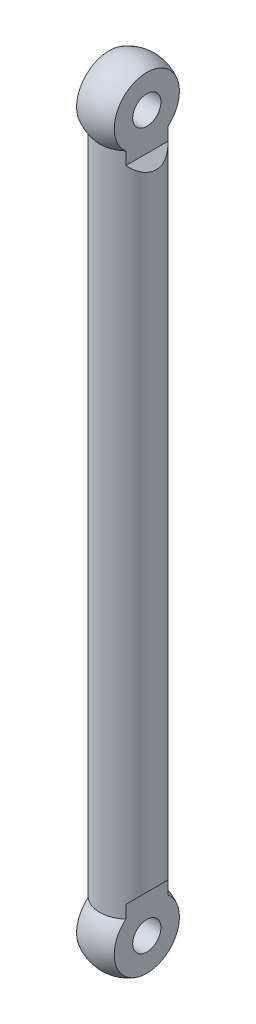
ISO-10303-21;
HEADER;
FILE_DESCRIPTION(('STEP AP214'),'2;1');
FILE_NAME('part.step','',(''),(''),'','','');
FILE_SCHEMA(('AUTOMOTIVE_DESIGN { 1 0 10303 214 1 1 1 1 }'));
ENDSEC;
DATA;
#1=APPLICATION_CONTEXT('core data for automotive mechanical design processes');
#2=APPLICATION_PROTOCOL_DEFINITION('international standard','automotive_design',2000,#1);
#3=PRODUCT_CONTEXT('',#1,'mechanical');
#4=PRODUCT('Part','Part','',(#3));
#5=PRODUCT_RELATED_PRODUCT_CATEGORY('part','',(#4));
#6=PRODUCT_DEFINITION_FORMATION('','',#4);
#7=PRODUCT_DEFINITION_CONTEXT('part definition',#1,'design');
#8=PRODUCT_DEFINITION('design','',#6,#7);
#9=PRODUCT_DEFINITION_SHAPE('','',#8);
#10=(LENGTH_UNIT() NAMED_UNIT(*) SI_UNIT(.MILLI.,.METRE.));
#11=(NAMED_UNIT(*) PLANE_ANGLE_UNIT() SI_UNIT($,.RADIAN.));
#12=(NAMED_UNIT(*) SI_UNIT($,.STERADIAN.) SOLID_ANGLE_UNIT());
#13=UNCERTAINTY_MEASURE_WITH_UNIT(LENGTH_MEASURE(1.E-05),#10,'distance_accuracy_value','');
#14=(GEOMETRIC_REPRESENTATION_CONTEXT(3) GLOBAL_UNCERTAINTY_ASSIGNED_CONTEXT((#13)) GLOBAL_UNIT_ASSIGNED_CONTEXT((#10,
#11,#12)) REPRESENTATION_CONTEXT('',''));
#15=CARTESIAN_POINT('',(0.,0.,0.));
#16=DIRECTION('',(0.,0.,1.));
#17=DIRECTION('',(1.,0.,0.));
#18=AXIS2_PLACEMENT_3D('',#15,#16,#17);
#19=CARTESIAN_POINT('',(0.,76.,0.));
#20=DIRECTION('',(0.,-1.,0.));
#21=DIRECTION('',(0.,0.,-1.));
#22=AXIS2_PLACEMENT_3D('',#19,#20,#21);
#23=SPHERICAL_SURFACE('',#22,4.);
#24=CARTESIAN_POINT('',(0.,73.3542486889354,0.));
#25=DIRECTION('',(0.,-1.,0.));
#26=DIRECTION('',(0.,0.,-1.));
#27=AXIS2_PLACEMENT_3D('',#24,#25,#26);
#28=CIRCLE('',#27,3.);
#29=CARTESIAN_POINT('',(-2.,73.3542486889354,-2.23606797749979));
#30=VERTEX_POINT('',#29);
#31=CARTESIAN_POINT('',(2.,73.3542486889354,-2.23606797749979));
#32=VERTEX_POINT('',#31);
#33=EDGE_CURVE('E185',#30,#32,#28,.T.);
#34=ORIENTED_EDGE('',*,*,#33,.F.);
#35=CARTESIAN_POINT('',(-2.,76.,0.));
#36=DIRECTION('',(-1.,0.,0.));
#37=DIRECTION('',(0.,-1.,0.));
#38=AXIS2_PLACEMENT_3D('',#35,#36,#37);
#39=CIRCLE('',#38,3.46410161513776);
#40=CARTESIAN_POINT('',(-2.00000000000001,73.3542486889354,2.23606797749978));
#41=VERTEX_POINT('',#40);
#42=EDGE_CURVE('E163',#30,#41,#39,.F.);
#43=ORIENTED_EDGE('',*,*,#42,.T.);
#44=CARTESIAN_POINT('',(2.00000000000001,73.3542486889354,2.23606797749978));
#45=VERTEX_POINT('',#44);
#46=EDGE_CURVE('E181',#45,#41,#28,.T.);
#47=ORIENTED_EDGE('',*,*,#46,.F.);
#48=CARTESIAN_POINT('',(2.,76.,0.));
#49=DIRECTION('',(-1.,0.,0.));
#50=DIRECTION('',(0.,-1.,0.));
#51=AXIS2_PLACEMENT_3D('',#48,#49,#50);
#52=CIRCLE('',#51,3.46410161513776);
#53=EDGE_CURVE('E67',#32,#45,#52,.F.);
#54=ORIENTED_EDGE('',*,*,#53,.F.);
#55=EDGE_LOOP('',(#34,#43,#47,#54));
#56=FACE_BOUND('',#55,.T.);
#57=ADVANCED_FACE('F44',(#56),#23,.T.);
#58=CARTESIAN_POINT('',(0.,0.,0.));
#59=DIRECTION('',(0.,-1.,0.));
#60=DIRECTION('',(0.,0.,1.));
#61=AXIS2_PLACEMENT_3D('',#58,#59,#60);
#62=SPHERICAL_SURFACE('',#61,4.);
#63=CARTESIAN_POINT('',(0.,2.64575131106459,0.));
#64=DIRECTION('',(0.,-1.,0.));
#65=DIRECTION('',(0.,0.,-1.));
#66=AXIS2_PLACEMENT_3D('',#63,#64,#65);
#67=CIRCLE('',#66,3.);
#68=CARTESIAN_POINT('',(2.,2.64575131106459,2.23606797749979));
#69=VERTEX_POINT('',#68);
#70=CARTESIAN_POINT('',(-2.,2.64575131106459,2.23606797749979));
#71=VERTEX_POINT('',#70);
#72=EDGE_CURVE('E190',#69,#71,#67,.T.);
#73=ORIENTED_EDGE('',*,*,#72,.T.);
#74=CARTESIAN_POINT('',(-2.,0.,0.));
#75=DIRECTION('',(-1.,0.,0.));
#76=DIRECTION('',(0.,-1.,0.));
#77=AXIS2_PLACEMENT_3D('',#74,#75,#76);
#78=CIRCLE('',#77,3.46410161513775);
#79=CARTESIAN_POINT('',(-2.,2.64575131106459,-2.23606797749979));
#80=VERTEX_POINT('',#79);
#81=EDGE_CURVE('E65',#71,#80,#78,.F.);
#82=ORIENTED_EDGE('',*,*,#81,.T.);
#83=CARTESIAN_POINT('',(2.,2.64575131106459,-2.23606797749979));
#84=VERTEX_POINT('',#83);
#85=EDGE_CURVE('E135',#80,#84,#67,.T.);
#86=ORIENTED_EDGE('',*,*,#85,.T.);
#87=CARTESIAN_POINT('',(2.,0.,0.));
#88=DIRECTION('',(-1.,0.,0.));
#89=DIRECTION('',(0.,-1.,0.));
#90=AXIS2_PLACEMENT_3D('',#87,#88,#89);
#91=CIRCLE('',#90,3.46410161513775);
#92=EDGE_CURVE('E171',#69,#84,#91,.F.);
#93=ORIENTED_EDGE('',*,*,#92,.F.);
#94=EDGE_LOOP('',(#73,#82,#86,#93));
#95=FACE_BOUND('',#94,.T.);
#96=ADVANCED_FACE('F212',(#95),#62,.T.);
#97=CARTESIAN_POINT('',(0.,-21.6284069477248,0.));
#98=DIRECTION('',(0.,-1.,0.));
#99=DIRECTION('',(0.,0.,-1.));
#100=AXIS2_PLACEMENT_3D('',#97,#98,#99);
#101=CYLINDRICAL_SURFACE('',#100,3.);
#102=ORIENTED_EDGE('',*,*,#85,.F.);
#103=DIRECTION('',(0.,-1.,0.));
#104=VECTOR('',#103,1.);
#105=CARTESIAN_POINT('',(-2.,-21.6284069477248,-2.23606797749979));
#106=LINE('',#105,#104);
#107=CARTESIAN_POINT('',(-2.,3.99999999999999,-2.23606797749979));
#108=VERTEX_POINT('',#107);
#109=EDGE_CURVE('E117',#80,#108,#106,.F.);
#110=ORIENTED_EDGE('',*,*,#109,.T.);
#111=CARTESIAN_POINT('',(0.,2.00000000000001,0.));
#112=DIRECTION('',(-0.707106781186544,-0.707106781186552,0.));
#113=DIRECTION('',(0.707106781186552,-0.707106781186544,0.));
#114=AXIS2_PLACEMENT_3D('',#111,#112,#113);
#115=ELLIPSE('',#114,4.24264068711926,3.);
#116=CARTESIAN_POINT('',(-2.,3.99999999999999,2.23606797749979));
#117=VERTEX_POINT('',#116);
#118=EDGE_CURVE('E114',#108,#117,#115,.F.);
#119=ORIENTED_EDGE('',*,*,#118,.T.);
#120=DIRECTION('',(0.,-1.,0.));
#121=VECTOR('',#120,1.);
#122=CARTESIAN_POINT('',(-2.,-21.6284069477248,2.23606797749979));
#123=LINE('',#122,#121);
#124=EDGE_CURVE('E123',#117,#71,#123,.T.);
#125=ORIENTED_EDGE('',*,*,#124,.T.);
#126=ORIENTED_EDGE('',*,*,#72,.F.);
#127=DIRECTION('',(0.,-1.,0.));
#128=VECTOR('',#127,1.);
#129=CARTESIAN_POINT('',(2.,-21.6284069477248,2.23606797749979));
#130=LINE('',#129,#128);
#131=CARTESIAN_POINT('',(2.,3.99999999999999,2.23606797749979));
#132=VERTEX_POINT('',#131);
#133=EDGE_CURVE('E194',#132,#69,#130,.T.);
#134=ORIENTED_EDGE('',*,*,#133,.F.);
#135=CARTESIAN_POINT('',(0.,2.00000000000001,0.));
#136=DIRECTION('',(-0.707106781186544,0.707106781186552,0.));
#137=DIRECTION('',(-0.707106781186552,-0.707106781186544,0.));
#138=AXIS2_PLACEMENT_3D('',#135,#136,#137);
#139=ELLIPSE('',#138,4.24264068711926,3.);
#140=CARTESIAN_POINT('',(2.,3.99999999999999,-2.23606797749979));
#141=VERTEX_POINT('',#140);
#142=EDGE_CURVE('E193',#141,#132,#139,.F.);
#143=ORIENTED_EDGE('',*,*,#142,.F.);
#144=DIRECTION('',(0.,-1.,0.));
#145=VECTOR('',#144,1.);
#146=CARTESIAN_POINT('',(2.,-21.6284069477248,-2.23606797749979));
#147=LINE('',#146,#145);
#148=EDGE_CURVE('E197',#84,#141,#147,.F.);
#149=ORIENTED_EDGE('',*,*,#148,.F.);
#150=EDGE_LOOP('',(#102,#110,#119,#125,#126,#134,#143,#149));
#151=FACE_BOUND('',#150,.T.);
#152=CARTESIAN_POINT('',(0.,74.,0.));
#153=DIRECTION('',(-0.707106781186544,0.707106781186552,0.));
#154=DIRECTION('',(-0.707106781186552,-0.707106781186544,0.));
#155=AXIS2_PLACEMENT_3D('',#152,#153,#154);
#156=ELLIPSE('',#155,4.24264068711926,3.);
#157=CARTESIAN_POINT('',(-2.,72.,2.23606797749978));
#158=VERTEX_POINT('',#157);
#159=CARTESIAN_POINT('',(-2.,72.,-2.23606797749978));
#160=VERTEX_POINT('',#159);
#161=EDGE_CURVE('E134',#158,#160,#156,.F.);
#162=ORIENTED_EDGE('',*,*,#161,.T.);
#163=DIRECTION('',(0.,-1.,0.));
#164=VECTOR('',#163,1.);
#165=CARTESIAN_POINT('',(-2.00000000000001,-21.6284069477248,-2.23606797749978));
#166=LINE('',#165,#164);
#167=EDGE_CURVE('E11',#160,#30,#166,.F.);
#168=ORIENTED_EDGE('',*,*,#167,.T.);
#169=ORIENTED_EDGE('',*,*,#33,.T.);
#170=DIRECTION('',(0.,-1.,0.));
#171=VECTOR('',#170,1.);
#172=CARTESIAN_POINT('',(2.00000000000001,-21.6284069477248,-2.23606797749978));
#173=LINE('',#172,#171);
#174=CARTESIAN_POINT('',(2.,72.,-2.23606797749978));
#175=VERTEX_POINT('',#174);
#176=EDGE_CURVE('E210',#175,#32,#173,.F.);
#177=ORIENTED_EDGE('',*,*,#176,.F.);
#178=CARTESIAN_POINT('',(0.,74.,0.));
#179=DIRECTION('',(-0.707106781186544,-0.707106781186552,0.));
#180=DIRECTION('',(0.707106781186552,-0.707106781186544,0.));
#181=AXIS2_PLACEMENT_3D('',#178,#179,#180);
#182=ELLIPSE('',#181,4.24264068711926,3.);
#183=CARTESIAN_POINT('',(2.,72.,2.23606797749978));
#184=VERTEX_POINT('',#183);
#185=EDGE_CURVE('E204',#184,#175,#182,.F.);
#186=ORIENTED_EDGE('',*,*,#185,.F.);
#187=DIRECTION('',(0.,-1.,0.));
#188=VECTOR('',#187,1.);
#189=CARTESIAN_POINT('',(2.00000000000001,-21.6284069477248,2.23606797749978));
#190=LINE('',#189,#188);
#191=EDGE_CURVE('E203',#45,#184,#190,.T.);
#192=ORIENTED_EDGE('',*,*,#191,.F.);
#193=ORIENTED_EDGE('',*,*,#46,.T.);
#194=DIRECTION('',(0.,-1.,0.));
#195=VECTOR('',#194,1.);
#196=CARTESIAN_POINT('',(-2.00000000000001,-21.6284069477248,2.23606797749978));
#197=LINE('',#196,#195);
#198=EDGE_CURVE('E53',#41,#158,#197,.T.);
#199=ORIENTED_EDGE('',*,*,#198,.T.);
#200=EDGE_LOOP('',(#162,#168,#169,#177,#186,#192,#193,#199));
#201=FACE_BOUND('',#200,.T.);
#202=ADVANCED_FACE('F129',(#151,#201),#101,.T.);
#203=CARTESIAN_POINT('',(2.,-9.14520140074776,-4.));
#204=DIRECTION('',(-1.,0.,0.));
#205=DIRECTION('',(0.,-1.,0.));
#206=AXIS2_PLACEMENT_3D('',#203,#204,#205);
#207=PLANE('',#206);
#208=CARTESIAN_POINT('',(2.,0.,0.));
#209=DIRECTION('',(-1.,0.,0.));
#210=DIRECTION('',(0.,-1.,0.));
#211=AXIS2_PLACEMENT_3D('',#208,#209,#210);
#212=CIRCLE('',#211,1.5);
#213=CARTESIAN_POINT('',(2.,-1.5,0.));
#214=VERTEX_POINT('',#213);
#215=EDGE_CURVE('E144',#214,#214,#212,.T.);
#216=ORIENTED_EDGE('',*,*,#215,.T.);
#217=EDGE_LOOP('',(#216));
#218=FACE_BOUND('',#217,.T.);
#219=ORIENTED_EDGE('',*,*,#148,.T.);
#220=DIRECTION('',(0.,0.,1.));
#221=VECTOR('',#220,1.);
#222=CARTESIAN_POINT('',(2.,3.99999999999999,-4.));
#223=LINE('',#222,#221);
#224=EDGE_CURVE('E169',#141,#132,#223,.T.);
#225=ORIENTED_EDGE('',*,*,#224,.T.);
#226=ORIENTED_EDGE('',*,*,#133,.T.);
#227=ORIENTED_EDGE('',*,*,#92,.T.);
#228=EDGE_LOOP('',(#219,#225,#226,#227));
#229=FACE_BOUND('',#228,.T.);
#230=ADVANCED_FACE('F216',(#218,#229),#207,.F.);
#231=CARTESIAN_POINT('',(2.,3.99999999999999,-4.));
#232=DIRECTION('',(-0.707106781186544,0.707106781186552,0.));
#233=DIRECTION('',(-0.707106781186552,-0.707106781186544,0.));
#234=AXIS2_PLACEMENT_3D('',#231,#232,#233);
#235=PLANE('',#234);
#236=ORIENTED_EDGE('',*,*,#224,.F.);
#237=ORIENTED_EDGE('',*,*,#142,.T.);
#238=EDGE_LOOP('',(#236,#237));
#239=FACE_BOUND('',#238,.T.);
#240=ADVANCED_FACE('F218',(#239),#235,.F.);
#241=CARTESIAN_POINT('',(2.,72.,-4.));
#242=DIRECTION('',(-0.707106781186544,-0.707106781186552,0.));
#243=DIRECTION('',(0.707106781186552,-0.707106781186544,0.));
#244=AXIS2_PLACEMENT_3D('',#241,#242,#243);
#245=PLANE('',#244);
#246=ORIENTED_EDGE('',*,*,#185,.T.);
#247=DIRECTION('',(0.,0.,1.));
#248=VECTOR('',#247,1.);
#249=CARTESIAN_POINT('',(2.,72.,-4.));
#250=LINE('',#249,#248);
#251=EDGE_CURVE('E166',#175,#184,#250,.T.);
#252=ORIENTED_EDGE('',*,*,#251,.T.);
#253=EDGE_LOOP('',(#246,#252));
#254=FACE_BOUND('',#253,.T.);
#255=ADVANCED_FACE('F222',(#254),#245,.F.);
#256=CARTESIAN_POINT('',(2.,85.1452014007478,-4.));
#257=DIRECTION('',(-1.,0.,0.));
#258=DIRECTION('',(0.,-1.,0.));
#259=AXIS2_PLACEMENT_3D('',#256,#257,#258);
#260=PLANE('',#259);
#261=CARTESIAN_POINT('',(2.,76.,0.));
#262=DIRECTION('',(-1.,0.,0.));
#263=DIRECTION('',(0.,-1.,0.));
#264=AXIS2_PLACEMENT_3D('',#261,#262,#263);
#265=CIRCLE('',#264,1.5);
#266=CARTESIAN_POINT('',(2.,74.5,0.));
#267=VERTEX_POINT('',#266);
#268=EDGE_CURVE('E127',#267,#267,#265,.T.);
#269=ORIENTED_EDGE('',*,*,#268,.T.);
#270=EDGE_LOOP('',(#269));
#271=FACE_BOUND('',#270,.T.);
#272=ORIENTED_EDGE('',*,*,#176,.T.);
#273=ORIENTED_EDGE('',*,*,#53,.T.);
#274=ORIENTED_EDGE('',*,*,#191,.T.);
#275=ORIENTED_EDGE('',*,*,#251,.F.);
#276=EDGE_LOOP('',(#272,#273,#274,#275));
#277=FACE_BOUND('',#276,.T.);
#278=ADVANCED_FACE('F228',(#271,#277),#260,.F.);
#279=CARTESIAN_POINT('',(-2.,3.99999999999999,-4.));
#280=DIRECTION('',(-0.707106781186544,-0.707106781186552,0.));
#281=DIRECTION('',(0.707106781186552,-0.707106781186544,0.));
#282=AXIS2_PLACEMENT_3D('',#279,#280,#281);
#283=PLANE('',#282);
#284=DIRECTION('',(0.,0.,1.));
#285=VECTOR('',#284,1.);
#286=CARTESIAN_POINT('',(-2.,3.99999999999999,-4.));
#287=LINE('',#286,#285);
#288=EDGE_CURVE('E118',#108,#117,#287,.T.);
#289=ORIENTED_EDGE('',*,*,#288,.T.);
#290=ORIENTED_EDGE('',*,*,#118,.F.);
#291=EDGE_LOOP('',(#289,#290));
#292=FACE_BOUND('',#291,.T.);
#293=ADVANCED_FACE('F113',(#292),#283,.T.);
#294=CARTESIAN_POINT('',(-2.,-9.14520140074776,-4.));
#295=DIRECTION('',(-1.,0.,0.));
#296=DIRECTION('',(0.,-1.,0.));
#297=AXIS2_PLACEMENT_3D('',#294,#295,#296);
#298=PLANE('',#297);
#299=CARTESIAN_POINT('',(-2.,0.,0.));
#300=DIRECTION('',(-1.,0.,0.));
#301=DIRECTION('',(0.,-1.,0.));
#302=AXIS2_PLACEMENT_3D('',#299,#300,#301);
#303=CIRCLE('',#302,1.5);
#304=CARTESIAN_POINT('',(-2.,-1.5,0.));
#305=VERTEX_POINT('',#304);
#306=EDGE_CURVE('E48',#305,#305,#303,.T.);
#307=ORIENTED_EDGE('',*,*,#306,.F.);
#308=EDGE_LOOP('',(#307));
#309=FACE_BOUND('',#308,.T.);
#310=ORIENTED_EDGE('',*,*,#81,.F.);
#311=ORIENTED_EDGE('',*,*,#124,.F.);
#312=ORIENTED_EDGE('',*,*,#288,.F.);
#313=ORIENTED_EDGE('',*,*,#109,.F.);
#314=EDGE_LOOP('',(#310,#311,#312,#313));
#315=FACE_BOUND('',#314,.T.);
#316=ADVANCED_FACE('F121',(#309,#315),#298,.T.);
#317=CARTESIAN_POINT('',(-2.,85.1452014007478,-4.));
#318=DIRECTION('',(-1.,0.,0.));
#319=DIRECTION('',(0.,-1.,0.));
#320=AXIS2_PLACEMENT_3D('',#317,#318,#319);
#321=PLANE('',#320);
#322=CARTESIAN_POINT('',(-2.,76.,0.));
#323=DIRECTION('',(-1.,0.,0.));
#324=DIRECTION('',(0.,-1.,0.));
#325=AXIS2_PLACEMENT_3D('',#322,#323,#324);
#326=CIRCLE('',#325,1.5);
#327=CARTESIAN_POINT('',(-2.,74.5,0.));
#328=VERTEX_POINT('',#327);
#329=EDGE_CURVE('E142',#328,#328,#326,.T.);
#330=ORIENTED_EDGE('',*,*,#329,.F.);
#331=EDGE_LOOP('',(#330));
#332=FACE_BOUND('',#331,.T.);
#333=DIRECTION('',(0.,0.,1.));
#334=VECTOR('',#333,1.);
#335=CARTESIAN_POINT('',(-2.,72.,-4.));
#336=LINE('',#335,#334);
#337=EDGE_CURVE('E122',#160,#158,#336,.T.);
#338=ORIENTED_EDGE('',*,*,#337,.T.);
#339=ORIENTED_EDGE('',*,*,#198,.F.);
#340=ORIENTED_EDGE('',*,*,#42,.F.);
#341=ORIENTED_EDGE('',*,*,#167,.F.);
#342=EDGE_LOOP('',(#338,#339,#340,#341));
#343=FACE_BOUND('',#342,.T.);
#344=ADVANCED_FACE('F248',(#332,#343),#321,.T.);
#345=CARTESIAN_POINT('',(-2.,72.,-4.));
#346=DIRECTION('',(-0.707106781186544,0.707106781186552,0.));
#347=DIRECTION('',(-0.707106781186552,-0.707106781186544,0.));
#348=AXIS2_PLACEMENT_3D('',#345,#346,#347);
#349=PLANE('',#348);
#350=ORIENTED_EDGE('',*,*,#161,.F.);
#351=ORIENTED_EDGE('',*,*,#337,.F.);
#352=EDGE_LOOP('',(#350,#351));
#353=FACE_BOUND('',#352,.T.);
#354=ADVANCED_FACE('F249',(#353),#349,.T.);
#355=CARTESIAN_POINT('',(-3.00000000000001,76.,0.));
#356=DIRECTION('',(1.,0.,0.));
#357=DIRECTION('',(0.,1.,0.));
#358=AXIS2_PLACEMENT_3D('',#355,#356,#357);
#359=CYLINDRICAL_SURFACE('',#358,1.5);
#360=ORIENTED_EDGE('',*,*,#329,.T.);
#361=EDGE_LOOP('',(#360));
#362=FACE_BOUND('',#361,.T.);
#363=ORIENTED_EDGE('',*,*,#268,.F.);
#364=EDGE_LOOP('',(#363));
#365=FACE_BOUND('',#364,.T.);
#366=ADVANCED_FACE('F253',(#362,#365),#359,.F.);
#367=CARTESIAN_POINT('',(-3.00000000000001,0.,0.));
#368=DIRECTION('',(1.,0.,0.));
#369=DIRECTION('',(0.,1.,0.));
#370=AXIS2_PLACEMENT_3D('',#367,#368,#369);
#371=CYLINDRICAL_SURFACE('',#370,1.5);
#372=ORIENTED_EDGE('',*,*,#306,.T.);
#373=EDGE_LOOP('',(#372));
#374=FACE_BOUND('',#373,.T.);
#375=ORIENTED_EDGE('',*,*,#215,.F.);
#376=EDGE_LOOP('',(#375));
#377=FACE_BOUND('',#376,.T.);
#378=ADVANCED_FACE('F256',(#374,#377),#371,.F.);
#379=CLOSED_SHELL('',(#57,#96,#202,#230,#240,#255,#278,#293,#316,#344,#354,#366,#378));
#380=MANIFOLD_SOLID_BREP('B2',#379);
#381=ADVANCED_BREP_SHAPE_REPRESENTATION('',(#18,#380),#14);
#382=SHAPE_DEFINITION_REPRESENTATION(#9,#381);
ENDSEC;
END-ISO-10303-21;
